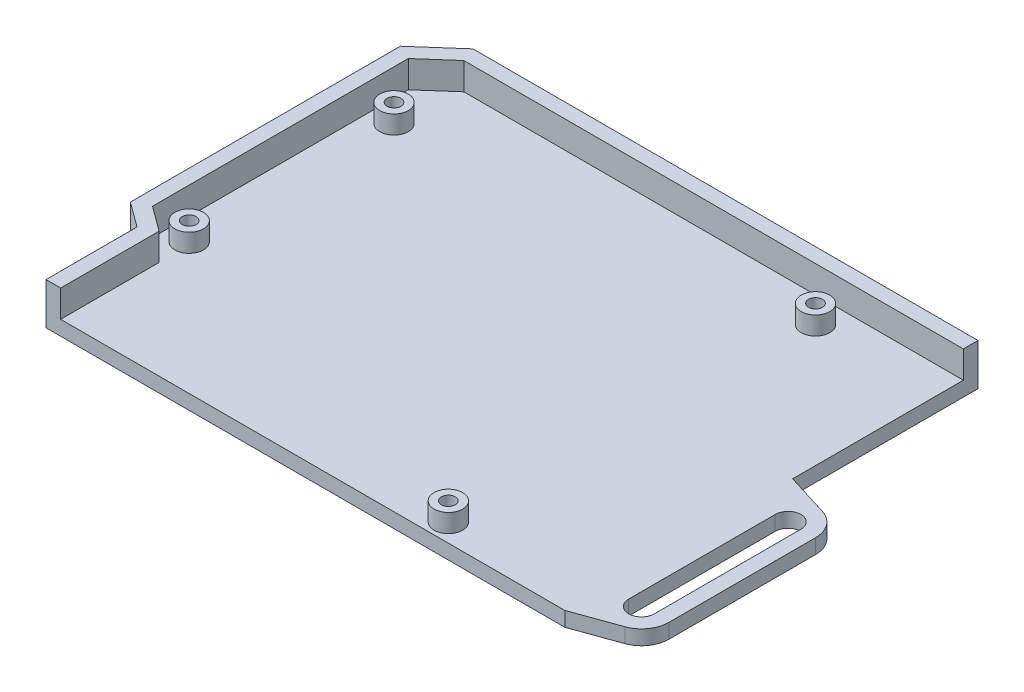
ISO-10303-21;
HEADER;
FILE_DESCRIPTION(('STEP AP214'),'2;1');
FILE_NAME('part.step','',(''),(''),'','','');
FILE_SCHEMA(('AUTOMOTIVE_DESIGN { 1 0 10303 214 1 1 1 1 }'));
ENDSEC;
DATA;
#1=APPLICATION_CONTEXT('core data for automotive mechanical design processes');
#2=APPLICATION_PROTOCOL_DEFINITION('international standard','automotive_design',2000,#1);
#3=PRODUCT_CONTEXT('',#1,'mechanical');
#4=PRODUCT('Part','Part','',(#3));
#5=PRODUCT_RELATED_PRODUCT_CATEGORY('part','',(#4));
#6=PRODUCT_DEFINITION_FORMATION('','',#4);
#7=PRODUCT_DEFINITION_CONTEXT('part definition',#1,'design');
#8=PRODUCT_DEFINITION('design','',#6,#7);
#9=PRODUCT_DEFINITION_SHAPE('','',#8);
#10=(LENGTH_UNIT() NAMED_UNIT(*) SI_UNIT(.MILLI.,.METRE.));
#11=(NAMED_UNIT(*) PLANE_ANGLE_UNIT() SI_UNIT($,.RADIAN.));
#12=(NAMED_UNIT(*) SI_UNIT($,.STERADIAN.) SOLID_ANGLE_UNIT());
#13=UNCERTAINTY_MEASURE_WITH_UNIT(LENGTH_MEASURE(1.E-05),#10,'distance_accuracy_value','');
#14=(GEOMETRIC_REPRESENTATION_CONTEXT(3) GLOBAL_UNCERTAINTY_ASSIGNED_CONTEXT((#13)) GLOBAL_UNIT_ASSIGNED_CONTEXT((#10,
#11,#12)) REPRESENTATION_CONTEXT('',''));
#15=CARTESIAN_POINT('',(0.,0.,0.));
#16=DIRECTION('',(0.,0.,1.));
#17=DIRECTION('',(1.,0.,0.));
#18=AXIS2_PLACEMENT_3D('',#15,#16,#17);
#19=CARTESIAN_POINT('',(73.8245355264989,2.,0.));
#20=DIRECTION('',(1.,0.,0.));
#21=DIRECTION('',(0.,0.,-1.));
#22=AXIS2_PLACEMENT_3D('',#19,#20,#21);
#23=PLANE('',#22);
#24=DIRECTION('',(0.,0.,1.));
#25=VECTOR('',#24,1.);
#26=CARTESIAN_POINT('',(73.8245355264989,0.,0.));
#27=LINE('',#26,#25);
#28=CARTESIAN_POINT('',(73.8245355264989,0.,-25.6999999999994));
#29=VERTEX_POINT('',#28);
#30=CARTESIAN_POINT('',(73.8245355264989,0.,-5.69999999999959));
#31=VERTEX_POINT('',#30);
#32=EDGE_CURVE('E485',#29,#31,#27,.T.);
#33=ORIENTED_EDGE('',*,*,#32,.F.);
#34=DIRECTION('',(0.,-1.,0.));
#35=VECTOR('',#34,1.);
#36=CARTESIAN_POINT('',(73.8245355264989,2.,-25.6999999999994));
#37=LINE('',#36,#35);
#38=CARTESIAN_POINT('',(73.8245355264989,2.,-25.6999999999994));
#39=VERTEX_POINT('',#38);
#40=EDGE_CURVE('E498',#39,#29,#37,.T.);
#41=ORIENTED_EDGE('',*,*,#40,.F.);
#42=DIRECTION('',(0.,0.,1.));
#43=VECTOR('',#42,1.);
#44=CARTESIAN_POINT('',(73.8245355264989,2.,0.));
#45=LINE('',#44,#43);
#46=CARTESIAN_POINT('',(73.8245355264989,2.,-5.69999999999959));
#47=VERTEX_POINT('',#46);
#48=EDGE_CURVE('E446',#39,#47,#45,.T.);
#49=ORIENTED_EDGE('',*,*,#48,.T.);
#50=DIRECTION('',(0.,-1.,0.));
#51=VECTOR('',#50,1.);
#52=CARTESIAN_POINT('',(73.8245355264989,2.,-5.69999999999959));
#53=LINE('',#52,#51);
#54=EDGE_CURVE('E500',#47,#31,#53,.T.);
#55=ORIENTED_EDGE('',*,*,#54,.T.);
#56=EDGE_LOOP('',(#33,#41,#49,#55));
#57=FACE_BOUND('',#56,.T.);
#58=ADVANCED_FACE('F197',(#57),#23,.T.);
#59=CARTESIAN_POINT('',(75.574535526499,2.,-25.6999999999992));
#60=DIRECTION('',(0.,-1.,0.));
#61=DIRECTION('',(0.,0.,-1.));
#62=AXIS2_PLACEMENT_3D('',#59,#60,#61);
#63=CYLINDRICAL_SURFACE('',#62,1.75000000000011);
#64=CARTESIAN_POINT('',(75.574535526499,0.,-25.6999999999992));
#65=DIRECTION('',(0.,1.,0.));
#66=DIRECTION('',(0.,0.,1.));
#67=AXIS2_PLACEMENT_3D('',#64,#65,#66);
#68=CIRCLE('',#67,1.75000000000011);
#69=CARTESIAN_POINT('',(77.3245355264991,0.,-25.6999999999994));
#70=VERTEX_POINT('',#69);
#71=EDGE_CURVE('E488',#70,#29,#68,.T.);
#72=ORIENTED_EDGE('',*,*,#71,.F.);
#73=DIRECTION('',(0.,-1.,0.));
#74=VECTOR('',#73,1.);
#75=CARTESIAN_POINT('',(77.3245355264991,2.,-25.6999999999994));
#76=LINE('',#75,#74);
#77=CARTESIAN_POINT('',(77.3245355264991,2.,-25.6999999999994));
#78=VERTEX_POINT('',#77);
#79=EDGE_CURVE('E495',#78,#70,#76,.T.);
#80=ORIENTED_EDGE('',*,*,#79,.F.);
#81=CARTESIAN_POINT('',(75.574535526499,2.,-25.6999999999992));
#82=DIRECTION('',(0.,1.,0.));
#83=DIRECTION('',(0.,0.,1.));
#84=AXIS2_PLACEMENT_3D('',#81,#82,#83);
#85=CIRCLE('',#84,1.75000000000011);
#86=EDGE_CURVE('E449',#78,#39,#85,.T.);
#87=ORIENTED_EDGE('',*,*,#86,.T.);
#88=ORIENTED_EDGE('',*,*,#40,.T.);
#89=EDGE_LOOP('',(#72,#80,#87,#88));
#90=FACE_BOUND('',#89,.T.);
#91=ADVANCED_FACE('F563',(#90),#63,.F.);
#92=CARTESIAN_POINT('',(77.3245355264991,2.,0.));
#93=DIRECTION('',(1.,0.,0.));
#94=DIRECTION('',(0.,0.,-1.));
#95=AXIS2_PLACEMENT_3D('',#92,#93,#94);
#96=PLANE('',#95);
#97=DIRECTION('',(0.,0.,1.));
#98=VECTOR('',#97,1.);
#99=CARTESIAN_POINT('',(77.3245355264991,0.,0.));
#100=LINE('',#99,#98);
#101=CARTESIAN_POINT('',(77.3245355264991,0.,-5.69999999999959));
#102=VERTEX_POINT('',#101);
#103=EDGE_CURVE('E429',#70,#102,#100,.T.);
#104=ORIENTED_EDGE('',*,*,#103,.T.);
#105=DIRECTION('',(0.,-1.,0.));
#106=VECTOR('',#105,1.);
#107=CARTESIAN_POINT('',(77.3245355264991,2.,-5.69999999999959));
#108=LINE('',#107,#106);
#109=CARTESIAN_POINT('',(77.3245355264991,2.,-5.69999999999959));
#110=VERTEX_POINT('',#109);
#111=EDGE_CURVE('E493',#110,#102,#108,.T.);
#112=ORIENTED_EDGE('',*,*,#111,.F.);
#113=DIRECTION('',(0.,0.,1.));
#114=VECTOR('',#113,1.);
#115=CARTESIAN_POINT('',(77.3245355264991,2.,0.));
#116=LINE('',#115,#114);
#117=EDGE_CURVE('E452',#78,#110,#116,.T.);
#118=ORIENTED_EDGE('',*,*,#117,.F.);
#119=ORIENTED_EDGE('',*,*,#79,.T.);
#120=EDGE_LOOP('',(#104,#112,#118,#119));
#121=FACE_BOUND('',#120,.T.);
#122=ADVANCED_FACE('F569',(#121),#96,.F.);
#123=CARTESIAN_POINT('',(75.574535526499,2.,-5.69999999999959));
#124=DIRECTION('',(0.,-1.,0.));
#125=DIRECTION('',(0.,0.,-1.));
#126=AXIS2_PLACEMENT_3D('',#123,#124,#125);
#127=CYLINDRICAL_SURFACE('',#126,1.75000000000011);
#128=CARTESIAN_POINT('',(75.574535526499,0.,-5.69999999999959));
#129=DIRECTION('',(0.,1.,0.));
#130=DIRECTION('',(0.,0.,1.));
#131=AXIS2_PLACEMENT_3D('',#128,#129,#130);
#132=CIRCLE('',#131,1.75000000000011);
#133=EDGE_CURVE('E482',#31,#102,#132,.T.);
#134=ORIENTED_EDGE('',*,*,#133,.F.);
#135=ORIENTED_EDGE('',*,*,#54,.F.);
#136=CARTESIAN_POINT('',(75.574535526499,2.,-5.69999999999959));
#137=DIRECTION('',(0.,1.,0.));
#138=DIRECTION('',(0.,0.,1.));
#139=AXIS2_PLACEMENT_3D('',#136,#137,#138);
#140=CIRCLE('',#139,1.75000000000011);
#141=EDGE_CURVE('E443',#47,#110,#140,.T.);
#142=ORIENTED_EDGE('',*,*,#141,.T.);
#143=ORIENTED_EDGE('',*,*,#111,.T.);
#144=EDGE_LOOP('',(#134,#135,#142,#143));
#145=FACE_BOUND('',#144,.T.);
#146=ADVANCED_FACE('F575',(#145),#127,.F.);
#147=CARTESIAN_POINT('',(75.574535526499,2.,-5.69999999999959));
#148=DIRECTION('',(0.,-1.,0.));
#149=DIRECTION('',(0.,0.,-1.));
#150=AXIS2_PLACEMENT_3D('',#147,#148,#149);
#151=CYLINDRICAL_SURFACE('',#150,3.75000000000011);
#152=CARTESIAN_POINT('',(75.574535526499,0.,-5.69999999999959));
#153=DIRECTION('',(0.,1.,0.));
#154=DIRECTION('',(0.,0.,1.));
#155=AXIS2_PLACEMENT_3D('',#152,#153,#154);
#156=CIRCLE('',#155,3.75000000000011);
#157=CARTESIAN_POINT('',(76.8422695780778,0.,-2.17078615347963));
#158=VERTEX_POINT('',#157);
#159=CARTESIAN_POINT('',(79.3245355264991,0.,-5.69999999999959));
#160=VERTEX_POINT('',#159);
#161=EDGE_CURVE('E457',#158,#160,#156,.T.);
#162=ORIENTED_EDGE('',*,*,#161,.T.);
#163=DIRECTION('',(0.,-1.,0.));
#164=VECTOR('',#163,1.);
#165=CARTESIAN_POINT('',(79.3245355264991,2.,-5.69999999999959));
#166=LINE('',#165,#164);
#167=CARTESIAN_POINT('',(79.3245355264991,2.,-5.69999999999959));
#168=VERTEX_POINT('',#167);
#169=EDGE_CURVE('E522',#168,#160,#166,.T.);
#170=ORIENTED_EDGE('',*,*,#169,.F.);
#171=CARTESIAN_POINT('',(75.574535526499,2.,-5.69999999999959));
#172=DIRECTION('',(0.,1.,0.));
#173=DIRECTION('',(0.,0.,1.));
#174=AXIS2_PLACEMENT_3D('',#171,#172,#173);
#175=CIRCLE('',#174,3.75000000000011);
#176=CARTESIAN_POINT('',(76.8422695780778,2.,-2.17078615347963));
#177=VERTEX_POINT('',#176);
#178=EDGE_CURVE('E428',#177,#168,#175,.T.);
#179=ORIENTED_EDGE('',*,*,#178,.F.);
#180=DIRECTION('',(0.,-1.,0.));
#181=VECTOR('',#180,1.);
#182=CARTESIAN_POINT('',(76.8422695780778,2.,-2.17078615347963));
#183=LINE('',#182,#181);
#184=EDGE_CURVE('E496',#177,#158,#183,.T.);
#185=ORIENTED_EDGE('',*,*,#184,.T.);
#186=EDGE_LOOP('',(#162,#170,#179,#185));
#187=FACE_BOUND('',#186,.T.);
#188=ADVANCED_FACE('F578',(#187),#151,.T.);
#189=CARTESIAN_POINT('',(79.3245355264991,2.,0.));
#190=DIRECTION('',(1.,0.,0.));
#191=DIRECTION('',(0.,0.,-1.));
#192=AXIS2_PLACEMENT_3D('',#189,#190,#191);
#193=PLANE('',#192);
#194=DIRECTION('',(0.,0.,1.));
#195=VECTOR('',#194,1.);
#196=CARTESIAN_POINT('',(79.3245355264991,0.,0.));
#197=LINE('',#196,#195);
#198=CARTESIAN_POINT('',(79.3245355264991,0.,-25.6999999999994));
#199=VERTEX_POINT('',#198);
#200=EDGE_CURVE('E460',#199,#160,#197,.T.);
#201=ORIENTED_EDGE('',*,*,#200,.F.);
#202=DIRECTION('',(0.,-1.,0.));
#203=VECTOR('',#202,1.);
#204=CARTESIAN_POINT('',(79.3245355264991,2.,-25.6999999999994));
#205=LINE('',#204,#203);
#206=CARTESIAN_POINT('',(79.3245355264991,2.,-25.6999999999994));
#207=VERTEX_POINT('',#206);
#208=EDGE_CURVE('E520',#207,#199,#205,.T.);
#209=ORIENTED_EDGE('',*,*,#208,.F.);
#210=DIRECTION('',(0.,0.,1.));
#211=VECTOR('',#210,1.);
#212=CARTESIAN_POINT('',(79.3245355264991,2.,0.));
#213=LINE('',#212,#211);
#214=EDGE_CURVE('E431',#207,#168,#213,.T.);
#215=ORIENTED_EDGE('',*,*,#214,.T.);
#216=ORIENTED_EDGE('',*,*,#169,.T.);
#217=EDGE_LOOP('',(#201,#209,#215,#216));
#218=FACE_BOUND('',#217,.T.);
#219=ADVANCED_FACE('F611',(#218),#193,.T.);
#220=CARTESIAN_POINT('',(75.574535526499,2.,-25.6999999999992));
#221=DIRECTION('',(0.,-1.,0.));
#222=DIRECTION('',(0.,0.,-1.));
#223=AXIS2_PLACEMENT_3D('',#220,#221,#222);
#224=CYLINDRICAL_SURFACE('',#223,3.75000000000011);
#225=CARTESIAN_POINT('',(75.574535526499,0.,-25.6999999999992));
#226=DIRECTION('',(0.,1.,0.));
#227=DIRECTION('',(0.,0.,1.));
#228=AXIS2_PLACEMENT_3D('',#225,#226,#227);
#229=CIRCLE('',#228,3.75000000000011);
#230=CARTESIAN_POINT('',(76.6771867461201,0.,-29.2842238054931));
#231=VERTEX_POINT('',#230);
#232=EDGE_CURVE('E463',#199,#231,#229,.T.);
#233=ORIENTED_EDGE('',*,*,#232,.T.);
#234=DIRECTION('',(0.,-1.,0.));
#235=VECTOR('',#234,1.);
#236=CARTESIAN_POINT('',(76.6771867461201,2.,-29.2842238054931));
#237=LINE('',#236,#235);
#238=CARTESIAN_POINT('',(76.6771867461201,2.,-29.2842238054931));
#239=VERTEX_POINT('',#238);
#240=EDGE_CURVE('E518',#239,#231,#237,.T.);
#241=ORIENTED_EDGE('',*,*,#240,.F.);
#242=CARTESIAN_POINT('',(75.574535526499,2.,-25.6999999999992));
#243=DIRECTION('',(0.,1.,0.));
#244=DIRECTION('',(0.,0.,1.));
#245=AXIS2_PLACEMENT_3D('',#242,#243,#244);
#246=CIRCLE('',#245,3.75000000000011);
#247=EDGE_CURVE('E434',#207,#239,#246,.T.);
#248=ORIENTED_EDGE('',*,*,#247,.F.);
#249=ORIENTED_EDGE('',*,*,#208,.T.);
#250=EDGE_LOOP('',(#233,#241,#248,#249));
#251=FACE_BOUND('',#250,.T.);
#252=ADVANCED_FACE('F607',(#251),#224,.T.);
#253=CARTESIAN_POINT('',(14.8595752663752,2.,-48.3018042890914));
#254=DIRECTION('',(0.294040325232303,0.,-0.955793014798331));
#255=DIRECTION('',(-0.955793014798331,0.,-0.294040325232303));
#256=AXIS2_PLACEMENT_3D('',#253,#254,#255);
#257=PLANE('',#256);
#258=DIRECTION('',(0.955793014798331,0.,0.294040325232303));
#259=VECTOR('',#258,1.);
#260=CARTESIAN_POINT('',(14.8595752663752,0.,-48.3018042890914));
#261=LINE('',#260,#259);
#262=CARTESIAN_POINT('',(70.799071052998,0.,-31.0925683146057));
#263=VERTEX_POINT('',#262);
#264=EDGE_CURVE('E466',#263,#231,#261,.T.);
#265=ORIENTED_EDGE('',*,*,#264,.F.);
#266=DIRECTION('',(0.,-1.,0.));
#267=VECTOR('',#266,1.);
#268=CARTESIAN_POINT('',(70.799071052998,2.,-31.0925683146057));
#269=LINE('',#268,#267);
#270=CARTESIAN_POINT('',(70.799071052998,2.,-31.0925683146057));
#271=VERTEX_POINT('',#270);
#272=EDGE_CURVE('E516',#271,#263,#269,.T.);
#273=ORIENTED_EDGE('',*,*,#272,.F.);
#274=DIRECTION('',(0.955793014798331,0.,0.294040325232303));
#275=VECTOR('',#274,1.);
#276=CARTESIAN_POINT('',(14.8595752663752,2.,-48.3018042890914));
#277=LINE('',#276,#275);
#278=EDGE_CURVE('E436',#271,#239,#277,.T.);
#279=ORIENTED_EDGE('',*,*,#278,.T.);
#280=ORIENTED_EDGE('',*,*,#240,.T.);
#281=EDGE_LOOP('',(#265,#273,#279,#280));
#282=FACE_BOUND('',#281,.T.);
#283=ADVANCED_FACE('F603',(#282),#257,.T.);
#284=CARTESIAN_POINT('',(70.799071052998,2.,0.));
#285=DIRECTION('',(-1.,0.,0.));
#286=DIRECTION('',(0.,0.,1.));
#287=AXIS2_PLACEMENT_3D('',#284,#285,#286);
#288=PLANE('',#287);
#289=DIRECTION('',(0.,0.,-1.));
#290=VECTOR('',#289,1.);
#291=CARTESIAN_POINT('',(70.799071052998,0.,0.));
#292=LINE('',#291,#290);
#293=CARTESIAN_POINT('',(70.799071052998,0.,-56.3999999999999));
#294=VERTEX_POINT('',#293);
#295=EDGE_CURVE('E469',#263,#294,#292,.T.);
#296=ORIENTED_EDGE('',*,*,#295,.T.);
#297=DIRECTION('',(0.,-1.,0.));
#298=VECTOR('',#297,1.);
#299=CARTESIAN_POINT('',(70.799071052998,2.,-56.3999999999999));
#300=LINE('',#299,#298);
#301=CARTESIAN_POINT('',(70.799071052998,5.7,-56.3999999999999));
#302=VERTEX_POINT('',#301);
#303=EDGE_CURVE('E354',#302,#294,#300,.T.);
#304=ORIENTED_EDGE('',*,*,#303,.F.);
#305=DIRECTION('',(0.,0.,-1.));
#306=VECTOR('',#305,1.);
#307=CARTESIAN_POINT('',(70.799071052998,5.7,-54.3999999999999));
#308=LINE('',#307,#306);
#309=CARTESIAN_POINT('',(70.799071052998,5.7,-54.3999999999999));
#310=VERTEX_POINT('',#309);
#311=EDGE_CURVE('E369',#310,#302,#308,.T.);
#312=ORIENTED_EDGE('',*,*,#311,.F.);
#313=DIRECTION('',(0.,-1.,0.));
#314=VECTOR('',#313,1.);
#315=CARTESIAN_POINT('',(70.799071052998,5.7,-54.3999999999999));
#316=LINE('',#315,#314);
#317=CARTESIAN_POINT('',(70.799071052998,2.,-54.3999999999999));
#318=VERTEX_POINT('',#317);
#319=EDGE_CURVE('E396',#310,#318,#316,.T.);
#320=ORIENTED_EDGE('',*,*,#319,.T.);
#321=DIRECTION('',(0.,0.,-1.));
#322=VECTOR('',#321,1.);
#323=CARTESIAN_POINT('',(70.799071052998,2.,0.));
#324=LINE('',#323,#322);
#325=EDGE_CURVE('E439',#271,#318,#324,.T.);
#326=ORIENTED_EDGE('',*,*,#325,.F.);
#327=ORIENTED_EDGE('',*,*,#272,.T.);
#328=EDGE_LOOP('',(#296,#304,#312,#320,#326,#327));
#329=FACE_BOUND('',#328,.T.);
#330=ADVANCED_FACE('F600',(#329),#288,.F.);
#331=CARTESIAN_POINT('',(0.,2.,-56.3999999999999));
#332=DIRECTION('',(0.,0.,1.));
#333=DIRECTION('',(1.,0.,0.));
#334=AXIS2_PLACEMENT_3D('',#331,#332,#333);
#335=PLANE('',#334);
#336=DIRECTION('',(-1.,0.,0.));
#337=VECTOR('',#336,1.);
#338=CARTESIAN_POINT('',(0.,0.,-56.3999999999999));
#339=LINE('',#338,#337);
#340=CARTESIAN_POINT('',(1.86591872622439,0.,-56.3999999999999));
#341=VERTEX_POINT('',#340);
#342=EDGE_CURVE('E351',#294,#341,#339,.T.);
#343=ORIENTED_EDGE('',*,*,#342,.T.);
#344=DIRECTION('',(0.,-1.,0.));
#345=VECTOR('',#344,1.);
#346=CARTESIAN_POINT('',(1.86591872622439,2.,-56.3999999999999));
#347=LINE('',#346,#345);
#348=CARTESIAN_POINT('',(1.86591872622439,5.7,-56.3999999999999));
#349=VERTEX_POINT('',#348);
#350=EDGE_CURVE('E344',#349,#341,#347,.T.);
#351=ORIENTED_EDGE('',*,*,#350,.F.);
#352=DIRECTION('',(-1.,0.,0.));
#353=VECTOR('',#352,1.);
#354=CARTESIAN_POINT('',(70.799071052998,5.7,-56.3999999999999));
#355=LINE('',#354,#353);
#356=EDGE_CURVE('E349',#302,#349,#355,.T.);
#357=ORIENTED_EDGE('',*,*,#356,.F.);
#358=ORIENTED_EDGE('',*,*,#303,.T.);
#359=EDGE_LOOP('',(#343,#351,#357,#358));
#360=FACE_BOUND('',#359,.T.);
#361=ADVANCED_FACE('F346',(#360),#335,.F.);
#362=CARTESIAN_POINT('',(-27.1630496706412,2.,-30.7932006379113));
#363=DIRECTION('',(0.66152000854493,0.,0.749927515360462));
#364=DIRECTION('',(0.749927515360462,0.,-0.66152000854493));
#365=AXIS2_PLACEMENT_3D('',#362,#363,#364);
#366=PLANE('',#365);
#367=DIRECTION('',(-0.749927515360462,0.,0.661520008544929));
#368=VECTOR('',#367,1.);
#369=CARTESIAN_POINT('',(-27.1630496706412,0.,-30.7932006379113));
#370=LINE('',#369,#368);
#371=CARTESIAN_POINT('',(-3.40092894700203,0.,-51.7540508296686));
#372=VERTEX_POINT('',#371);
#373=EDGE_CURVE('E472',#341,#372,#370,.T.);
#374=ORIENTED_EDGE('',*,*,#373,.T.);
#375=DIRECTION('',(0.,-1.,0.));
#376=VECTOR('',#375,1.);
#377=CARTESIAN_POINT('',(-3.40092894700203,2.,-51.7540508296686));
#378=LINE('',#377,#376);
#379=CARTESIAN_POINT('',(-3.40092894700203,5.7,-51.7540508296686));
#380=VERTEX_POINT('',#379);
#381=EDGE_CURVE('E355',#380,#372,#378,.T.);
#382=ORIENTED_EDGE('',*,*,#381,.F.);
#383=DIRECTION('',(-0.749927515360462,0.,0.661520008544929));
#384=VECTOR('',#383,1.);
#385=CARTESIAN_POINT('',(1.86591872622439,5.7,-56.3999999999999));
#386=LINE('',#385,#384);
#387=EDGE_CURVE('E358',#349,#380,#386,.T.);
#388=ORIENTED_EDGE('',*,*,#387,.F.);
#389=ORIENTED_EDGE('',*,*,#350,.T.);
#390=EDGE_LOOP('',(#374,#382,#388,#389));
#391=FACE_BOUND('',#390,.T.);
#392=ADVANCED_FACE('F359',(#391),#366,.F.);
#393=CARTESIAN_POINT('',(-3.40092894700199,2.,0.));
#394=DIRECTION('',(1.,0.,0.));
#395=DIRECTION('',(0.,0.,-1.));
#396=AXIS2_PLACEMENT_3D('',#393,#394,#395);
#397=PLANE('',#396);
#398=DIRECTION('',(0.,0.,1.));
#399=VECTOR('',#398,1.);
#400=CARTESIAN_POINT('',(-3.40092894700199,0.,0.));
#401=LINE('',#400,#399);
#402=CARTESIAN_POINT('',(-3.400928947002,0.,-14.9219400472764));
#403=VERTEX_POINT('',#402);
#404=EDGE_CURVE('E474',#372,#403,#401,.T.);
#405=ORIENTED_EDGE('',*,*,#404,.T.);
#406=DIRECTION('',(0.,-1.,0.));
#407=VECTOR('',#406,1.);
#408=CARTESIAN_POINT('',(-3.400928947002,2.,-14.9219400472764));
#409=LINE('',#408,#407);
#410=CARTESIAN_POINT('',(-3.400928947002,5.7,-14.9219400472764));
#411=VERTEX_POINT('',#410);
#412=EDGE_CURVE('E511',#411,#403,#409,.T.);
#413=ORIENTED_EDGE('',*,*,#412,.F.);
#414=DIRECTION('',(0.,0.,1.));
#415=VECTOR('',#414,1.);
#416=CARTESIAN_POINT('',(-3.40092894700203,5.7,-51.7540508296686));
#417=LINE('',#416,#415);
#418=EDGE_CURVE('E364',#380,#411,#417,.T.);
#419=ORIENTED_EDGE('',*,*,#418,.F.);
#420=ORIENTED_EDGE('',*,*,#381,.T.);
#421=EDGE_LOOP('',(#405,#413,#419,#420));
#422=FACE_BOUND('',#421,.T.);
#423=ADVANCED_FACE('F591',(#422),#397,.F.);
#424=CARTESIAN_POINT('',(5.92801163938671,2.,-8.06429855302219));
#425=DIRECTION('',(0.592285409734433,0.,-0.805728237941128));
#426=DIRECTION('',(-0.805728237941128,0.,-0.592285409734433));
#427=AXIS2_PLACEMENT_3D('',#424,#425,#426);
#428=PLANE('',#427);
#429=DIRECTION('',(0.805728237941128,0.,0.592285409734433));
#430=VECTOR('',#429,1.);
#431=CARTESIAN_POINT('',(5.92801163938671,0.,-8.06429855302219));
#432=LINE('',#431,#430);
#433=CARTESIAN_POINT('',(0.,0.,-12.4219400472765));
#434=VERTEX_POINT('',#433);
#435=EDGE_CURVE('E476',#403,#434,#432,.T.);
#436=ORIENTED_EDGE('',*,*,#435,.T.);
#437=DIRECTION('',(0.,-1.,0.));
#438=VECTOR('',#437,1.);
#439=CARTESIAN_POINT('',(0.,2.,-12.4219400472765));
#440=LINE('',#439,#438);
#441=CARTESIAN_POINT('',(0.,5.7,-12.4219400472765));
#442=VERTEX_POINT('',#441);
#443=EDGE_CURVE('E508',#442,#434,#440,.T.);
#444=ORIENTED_EDGE('',*,*,#443,.F.);
#445=DIRECTION('',(0.805728237941128,0.,0.592285409734434));
#446=VECTOR('',#445,1.);
#447=CARTESIAN_POINT('',(-3.400928947002,5.7,-14.9219400472764));
#448=LINE('',#447,#446);
#449=EDGE_CURVE('E377',#411,#442,#448,.T.);
#450=ORIENTED_EDGE('',*,*,#449,.F.);
#451=ORIENTED_EDGE('',*,*,#412,.T.);
#452=EDGE_LOOP('',(#436,#444,#450,#451));
#453=FACE_BOUND('',#452,.T.);
#454=ADVANCED_FACE('F587',(#453),#428,.F.);
#455=CARTESIAN_POINT('',(0.,2.,0.));
#456=DIRECTION('',(1.,0.,0.));
#457=DIRECTION('',(0.,0.,-1.));
#458=AXIS2_PLACEMENT_3D('',#455,#456,#457);
#459=PLANE('',#458);
#460=DIRECTION('',(0.,0.,1.));
#461=VECTOR('',#460,1.);
#462=CARTESIAN_POINT('',(0.,0.,0.));
#463=LINE('',#462,#461);
#464=CARTESIAN_POINT('',(0.,0.,0.));
#465=VERTEX_POINT('',#464);
#466=EDGE_CURVE('E478',#434,#465,#463,.T.);
#467=ORIENTED_EDGE('',*,*,#466,.T.);
#468=DIRECTION('',(0.,-1.,0.));
#469=VECTOR('',#468,1.);
#470=CARTESIAN_POINT('',(0.,2.,0.));
#471=LINE('',#470,#469);
#472=CARTESIAN_POINT('',(0.,5.7,0.));
#473=VERTEX_POINT('',#472);
#474=EDGE_CURVE('E505',#473,#465,#471,.T.);
#475=ORIENTED_EDGE('',*,*,#474,.F.);
#476=DIRECTION('',(0.,0.,1.));
#477=VECTOR('',#476,1.);
#478=CARTESIAN_POINT('',(0.,5.7,-12.4219400472765));
#479=LINE('',#478,#477);
#480=EDGE_CURVE('E380',#442,#473,#479,.T.);
#481=ORIENTED_EDGE('',*,*,#480,.F.);
#482=ORIENTED_EDGE('',*,*,#443,.T.);
#483=EDGE_LOOP('',(#467,#475,#481,#482));
#484=FACE_BOUND('',#483,.T.);
#485=ADVANCED_FACE('F583',(#484),#459,.F.);
#486=CARTESIAN_POINT('',(0.,2.,0.));
#487=DIRECTION('',(0.,0.,-1.));
#488=DIRECTION('',(-1.,0.,0.));
#489=AXIS2_PLACEMENT_3D('',#486,#487,#488);
#490=PLANE('',#489);
#491=DIRECTION('',(1.,0.,0.));
#492=VECTOR('',#491,1.);
#493=CARTESIAN_POINT('',(0.,0.,0.));
#494=LINE('',#493,#492);
#495=CARTESIAN_POINT('',(70.799071052998,0.,0.));
#496=VERTEX_POINT('',#495);
#497=EDGE_CURVE('E480',#465,#496,#494,.T.);
#498=ORIENTED_EDGE('',*,*,#497,.T.);
#499=DIRECTION('',(0.,-1.,0.));
#500=VECTOR('',#499,1.);
#501=CARTESIAN_POINT('',(70.799071052998,2.,0.));
#502=LINE('',#501,#500);
#503=CARTESIAN_POINT('',(70.799071052998,2.,0.));
#504=VERTEX_POINT('',#503);
#505=EDGE_CURVE('E454',#504,#496,#502,.T.);
#506=ORIENTED_EDGE('',*,*,#505,.F.);
#507=DIRECTION('',(1.,0.,0.));
#508=VECTOR('',#507,1.);
#509=CARTESIAN_POINT('',(0.,2.,0.));
#510=LINE('',#509,#508);
#511=CARTESIAN_POINT('',(2.,2.,0.));
#512=VERTEX_POINT('',#511);
#513=EDGE_CURVE('E441',#512,#504,#510,.T.);
#514=ORIENTED_EDGE('',*,*,#513,.F.);
#515=DIRECTION('',(0.,-1.,0.));
#516=VECTOR('',#515,1.);
#517=CARTESIAN_POINT('',(2.,5.7,0.));
#518=LINE('',#517,#516);
#519=CARTESIAN_POINT('',(2.,5.7,0.));
#520=VERTEX_POINT('',#519);
#521=EDGE_CURVE('E421',#520,#512,#518,.T.);
#522=ORIENTED_EDGE('',*,*,#521,.F.);
#523=DIRECTION('',(1.,0.,0.));
#524=VECTOR('',#523,1.);
#525=CARTESIAN_POINT('',(0.,5.7,0.));
#526=LINE('',#525,#524);
#527=EDGE_CURVE('E383',#473,#520,#526,.T.);
#528=ORIENTED_EDGE('',*,*,#527,.F.);
#529=ORIENTED_EDGE('',*,*,#474,.T.);
#530=EDGE_LOOP('',(#498,#506,#514,#522,#528,#529));
#531=FACE_BOUND('',#530,.T.);
#532=ADVANCED_FACE('F580',(#531),#490,.F.);
#533=CARTESIAN_POINT('',(8.09135648219427,2.,22.5253295819631));
#534=DIRECTION('',(-0.338062413754331,0.,-0.941123692405305));
#535=DIRECTION('',(-0.941123692405305,0.,0.338062413754331));
#536=AXIS2_PLACEMENT_3D('',#533,#534,#535);
#537=PLANE('',#536);
#538=DIRECTION('',(0.941123692405305,0.,-0.338062413754331));
#539=VECTOR('',#538,1.);
#540=CARTESIAN_POINT('',(8.09135648219427,0.,22.5253295819631));
#541=LINE('',#540,#539);
#542=EDGE_CURVE('E424',#496,#158,#541,.T.);
#543=ORIENTED_EDGE('',*,*,#542,.T.);
#544=ORIENTED_EDGE('',*,*,#184,.F.);
#545=DIRECTION('',(0.941123692405305,0.,-0.338062413754331));
#546=VECTOR('',#545,1.);
#547=CARTESIAN_POINT('',(8.09135648219427,2.,22.5253295819631));
#548=LINE('',#547,#546);
#549=EDGE_CURVE('E425',#504,#177,#548,.T.);
#550=ORIENTED_EDGE('',*,*,#549,.F.);
#551=ORIENTED_EDGE('',*,*,#505,.T.);
#552=EDGE_LOOP('',(#543,#544,#550,#551));
#553=FACE_BOUND('',#552,.T.);
#554=ADVANCED_FACE('F199',(#553),#537,.F.);
#555=CARTESIAN_POINT('',(0.,0.,0.));
#556=DIRECTION('',(0.,1.,0.));
#557=DIRECTION('',(0.,0.,1.));
#558=AXIS2_PLACEMENT_3D('',#555,#556,#557);
#559=PLANE('',#558);
#560=ORIENTED_EDGE('',*,*,#542,.F.);
#561=ORIENTED_EDGE('',*,*,#497,.F.);
#562=ORIENTED_EDGE('',*,*,#466,.F.);
#563=ORIENTED_EDGE('',*,*,#435,.F.);
#564=ORIENTED_EDGE('',*,*,#404,.F.);
#565=ORIENTED_EDGE('',*,*,#373,.F.);
#566=ORIENTED_EDGE('',*,*,#342,.F.);
#567=ORIENTED_EDGE('',*,*,#295,.F.);
#568=ORIENTED_EDGE('',*,*,#264,.T.);
#569=ORIENTED_EDGE('',*,*,#232,.F.);
#570=ORIENTED_EDGE('',*,*,#200,.T.);
#571=ORIENTED_EDGE('',*,*,#161,.F.);
#572=EDGE_LOOP('',(#560,#561,#562,#563,#564,#565,#566,#567,#568,#569,#570,#571));
#573=FACE_BOUND('',#572,.T.);
#574=ORIENTED_EDGE('',*,*,#133,.T.);
#575=ORIENTED_EDGE('',*,*,#103,.F.);
#576=ORIENTED_EDGE('',*,*,#71,.T.);
#577=ORIENTED_EDGE('',*,*,#32,.T.);
#578=EDGE_LOOP('',(#574,#575,#576,#577));
#579=FACE_BOUND('',#578,.T.);
#580=ADVANCED_FACE('F625',(#573,#579),#559,.F.);
#581=CARTESIAN_POINT('',(0.,2.,0.));
#582=DIRECTION('',(0.,1.,0.));
#583=DIRECTION('',(0.,0.,1.));
#584=AXIS2_PLACEMENT_3D('',#581,#582,#583);
#585=PLANE('',#584);
#586=CARTESIAN_POINT('',(54.119071052998,2.,-50.8999999999999));
#587=DIRECTION('',(0.,1.,0.));
#588=DIRECTION('',(0.,0.,1.));
#589=AXIS2_PLACEMENT_3D('',#586,#587,#588);
#590=CIRCLE('',#589,1.95000000000002);
#591=CARTESIAN_POINT('',(54.119071052998,2.,-48.9499999999999));
#592=VERTEX_POINT('',#591);
#593=EDGE_CURVE('E744',#592,#592,#590,.T.);
#594=ORIENTED_EDGE('',*,*,#593,.F.);
#595=EDGE_LOOP('',(#594));
#596=FACE_BOUND('',#595,.T.);
#597=CARTESIAN_POINT('',(52.409071052998,2.,-2.50499999999998));
#598=DIRECTION('',(0.,1.,0.));
#599=DIRECTION('',(0.,0.,1.));
#600=AXIS2_PLACEMENT_3D('',#597,#598,#599);
#601=CIRCLE('',#600,1.95000000000001);
#602=CARTESIAN_POINT('',(52.409071052998,2.,-0.554999999999965));
#603=VERTEX_POINT('',#602);
#604=EDGE_CURVE('E735',#603,#603,#601,.T.);
#605=ORIENTED_EDGE('',*,*,#604,.F.);
#606=EDGE_LOOP('',(#605));
#607=FACE_BOUND('',#606,.T.);
#608=CARTESIAN_POINT('',(1.59907105299799,2.,-17.9399999999998));
#609=DIRECTION('',(0.,1.,0.));
#610=DIRECTION('',(0.,0.,1.));
#611=AXIS2_PLACEMENT_3D('',#608,#609,#610);
#612=CIRCLE('',#611,1.95000000000001);
#613=CARTESIAN_POINT('',(1.59907105299799,2.,-15.9899999999998));
#614=VERTEX_POINT('',#613);
#615=EDGE_CURVE('E725',#614,#614,#612,.T.);
#616=ORIENTED_EDGE('',*,*,#615,.F.);
#617=EDGE_LOOP('',(#616));
#618=FACE_BOUND('',#617,.T.);
#619=CARTESIAN_POINT('',(1.59907105299797,2.,-45.8999999999998));
#620=DIRECTION('',(0.,1.,0.));
#621=DIRECTION('',(0.,0.,1.));
#622=AXIS2_PLACEMENT_3D('',#619,#620,#621);
#623=CIRCLE('',#622,1.95000000000001);
#624=CARTESIAN_POINT('',(1.59907105299797,2.,-43.9499999999998));
#625=VERTEX_POINT('',#624);
#626=EDGE_CURVE('E373',#625,#625,#623,.T.);
#627=ORIENTED_EDGE('',*,*,#626,.F.);
#628=EDGE_LOOP('',(#627));
#629=FACE_BOUND('',#628,.T.);
#630=DIRECTION('',(1.,0.,0.));
#631=VECTOR('',#630,1.);
#632=CARTESIAN_POINT('',(70.799071052998,2.,-54.3999999999999));
#633=LINE('',#632,#631);
#634=CARTESIAN_POINT('',(2.6219729087414,2.,-54.3999999999999));
#635=VERTEX_POINT('',#634);
#636=EDGE_CURVE('E212',#635,#318,#633,.T.);
#637=ORIENTED_EDGE('',*,*,#636,.F.);
#638=DIRECTION('',(0.749927515360462,0.,-0.66152000854493));
#639=VECTOR('',#638,1.);
#640=CARTESIAN_POINT('',(2.6219729087414,2.,-54.3999999999999));
#641=LINE('',#640,#639);
#642=CARTESIAN_POINT('',(-1.40092894700203,2.,-50.8513502765561));
#643=VERTEX_POINT('',#642);
#644=EDGE_CURVE('E216',#643,#635,#641,.T.);
#645=ORIENTED_EDGE('',*,*,#644,.F.);
#646=DIRECTION('',(0.,0.,-1.));
#647=VECTOR('',#646,1.);
#648=CARTESIAN_POINT('',(-1.40092894700203,2.,-50.8513502765561));
#649=LINE('',#648,#647);
#650=CARTESIAN_POINT('',(-1.400928947002,2.,-15.9339800157586));
#651=VERTEX_POINT('',#650);
#652=EDGE_CURVE('E404',#651,#643,#649,.T.);
#653=ORIENTED_EDGE('',*,*,#652,.F.);
#654=DIRECTION('',(-0.805728237941128,0.,-0.592285409734433));
#655=VECTOR('',#654,1.);
#656=CARTESIAN_POINT('',(-1.400928947002,2.,-15.9339800157586));
#657=LINE('',#656,#655);
#658=CARTESIAN_POINT('',(2.,2.,-13.4339800157587));
#659=VERTEX_POINT('',#658);
#660=EDGE_CURVE('E400',#659,#651,#657,.T.);
#661=ORIENTED_EDGE('',*,*,#660,.F.);
#662=DIRECTION('',(0.,0.,-1.));
#663=VECTOR('',#662,1.);
#664=CARTESIAN_POINT('',(2.,2.,-13.4339800157587));
#665=LINE('',#664,#663);
#666=EDGE_CURVE('E397',#512,#659,#665,.T.);
#667=ORIENTED_EDGE('',*,*,#666,.F.);
#668=ORIENTED_EDGE('',*,*,#513,.T.);
#669=ORIENTED_EDGE('',*,*,#549,.T.);
#670=ORIENTED_EDGE('',*,*,#178,.T.);
#671=ORIENTED_EDGE('',*,*,#214,.F.);
#672=ORIENTED_EDGE('',*,*,#247,.T.);
#673=ORIENTED_EDGE('',*,*,#278,.F.);
#674=ORIENTED_EDGE('',*,*,#325,.T.);
#675=EDGE_LOOP('',(#637,#645,#653,#661,#667,#668,#669,#670,#671,#672,#673,#674));
#676=FACE_BOUND('',#675,.T.);
#677=ORIENTED_EDGE('',*,*,#141,.F.);
#678=ORIENTED_EDGE('',*,*,#48,.F.);
#679=ORIENTED_EDGE('',*,*,#86,.F.);
#680=ORIENTED_EDGE('',*,*,#117,.T.);
#681=EDGE_LOOP('',(#677,#678,#679,#680));
#682=FACE_BOUND('',#681,.T.);
#683=ADVANCED_FACE('F551',(#596,#607,#618,#629,#676,#682),#585,.T.);
#684=CARTESIAN_POINT('',(2.,5.7,-13.4339800157587));
#685=DIRECTION('',(-1.,0.,0.));
#686=DIRECTION('',(0.,0.,1.));
#687=AXIS2_PLACEMENT_3D('',#684,#685,#686);
#688=PLANE('',#687);
#689=ORIENTED_EDGE('',*,*,#666,.T.);
#690=DIRECTION('',(0.,-1.,0.));
#691=VECTOR('',#690,1.);
#692=CARTESIAN_POINT('',(2.,5.7,-13.4339800157587));
#693=LINE('',#692,#691);
#694=CARTESIAN_POINT('',(2.,5.7,-13.4339800157587));
#695=VERTEX_POINT('',#694);
#696=EDGE_CURVE('E418',#695,#659,#693,.T.);
#697=ORIENTED_EDGE('',*,*,#696,.F.);
#698=DIRECTION('',(0.,0.,-1.));
#699=VECTOR('',#698,1.);
#700=CARTESIAN_POINT('',(2.,5.7,-13.4339800157587));
#701=LINE('',#700,#699);
#702=EDGE_CURVE('E385',#520,#695,#701,.T.);
#703=ORIENTED_EDGE('',*,*,#702,.F.);
#704=ORIENTED_EDGE('',*,*,#521,.T.);
#705=EDGE_LOOP('',(#689,#697,#703,#704));
#706=FACE_BOUND('',#705,.T.);
#707=ADVANCED_FACE('F666',(#706),#688,.F.);
#708=CARTESIAN_POINT('',(-1.400928947002,5.7,-15.9339800157586));
#709=DIRECTION('',(-0.592285409734433,0.,0.805728237941128));
#710=DIRECTION('',(0.805728237941128,0.,0.592285409734433));
#711=AXIS2_PLACEMENT_3D('',#708,#709,#710);
#712=PLANE('',#711);
#713=ORIENTED_EDGE('',*,*,#660,.T.);
#714=DIRECTION('',(0.,-1.,0.));
#715=VECTOR('',#714,1.);
#716=CARTESIAN_POINT('',(-1.400928947002,5.7,-15.9339800157586));
#717=LINE('',#716,#715);
#718=CARTESIAN_POINT('',(-1.400928947002,5.7,-15.9339800157586));
#719=VERTEX_POINT('',#718);
#720=EDGE_CURVE('E415',#719,#651,#717,.T.);
#721=ORIENTED_EDGE('',*,*,#720,.F.);
#722=DIRECTION('',(-0.805728237941128,0.,-0.592285409734433));
#723=VECTOR('',#722,1.);
#724=CARTESIAN_POINT('',(-1.400928947002,5.7,-15.9339800157586));
#725=LINE('',#724,#723);
#726=EDGE_CURVE('E387',#695,#719,#725,.T.);
#727=ORIENTED_EDGE('',*,*,#726,.F.);
#728=ORIENTED_EDGE('',*,*,#696,.T.);
#729=EDGE_LOOP('',(#713,#721,#727,#728));
#730=FACE_BOUND('',#729,.T.);
#731=ADVANCED_FACE('F661',(#730),#712,.F.);
#732=CARTESIAN_POINT('',(-1.40092894700203,5.7,-50.8513502765561));
#733=DIRECTION('',(-1.,0.,0.));
#734=DIRECTION('',(0.,0.,1.));
#735=AXIS2_PLACEMENT_3D('',#732,#733,#734);
#736=PLANE('',#735);
#737=ORIENTED_EDGE('',*,*,#652,.T.);
#738=DIRECTION('',(0.,-1.,0.));
#739=VECTOR('',#738,1.);
#740=CARTESIAN_POINT('',(-1.40092894700203,5.7,-50.8513502765561));
#741=LINE('',#740,#739);
#742=CARTESIAN_POINT('',(-1.40092894700203,5.7,-50.8513502765561));
#743=VERTEX_POINT('',#742);
#744=EDGE_CURVE('E412',#743,#643,#741,.T.);
#745=ORIENTED_EDGE('',*,*,#744,.F.);
#746=DIRECTION('',(0.,0.,-1.));
#747=VECTOR('',#746,1.);
#748=CARTESIAN_POINT('',(-1.40092894700203,5.7,-50.8513502765561));
#749=LINE('',#748,#747);
#750=EDGE_CURVE('E389',#719,#743,#749,.T.);
#751=ORIENTED_EDGE('',*,*,#750,.F.);
#752=ORIENTED_EDGE('',*,*,#720,.T.);
#753=EDGE_LOOP('',(#737,#745,#751,#752));
#754=FACE_BOUND('',#753,.T.);
#755=ADVANCED_FACE('F658',(#754),#736,.F.);
#756=CARTESIAN_POINT('',(2.6219729087414,5.7,-54.3999999999999));
#757=DIRECTION('',(-0.66152000854493,0.,-0.749927515360462));
#758=DIRECTION('',(-0.749927515360462,0.,0.66152000854493));
#759=AXIS2_PLACEMENT_3D('',#756,#757,#758);
#760=PLANE('',#759);
#761=ORIENTED_EDGE('',*,*,#644,.T.);
#762=DIRECTION('',(0.,-1.,0.));
#763=VECTOR('',#762,1.);
#764=CARTESIAN_POINT('',(2.6219729087414,5.7,-54.3999999999999));
#765=LINE('',#764,#763);
#766=CARTESIAN_POINT('',(2.6219729087414,5.7,-54.3999999999999));
#767=VERTEX_POINT('',#766);
#768=EDGE_CURVE('E409',#767,#635,#765,.T.);
#769=ORIENTED_EDGE('',*,*,#768,.F.);
#770=DIRECTION('',(0.749927515360462,0.,-0.66152000854493));
#771=VECTOR('',#770,1.);
#772=CARTESIAN_POINT('',(2.6219729087414,5.7,-54.3999999999999));
#773=LINE('',#772,#771);
#774=EDGE_CURVE('E391',#743,#767,#773,.T.);
#775=ORIENTED_EDGE('',*,*,#774,.F.);
#776=ORIENTED_EDGE('',*,*,#744,.T.);
#777=EDGE_LOOP('',(#761,#769,#775,#776));
#778=FACE_BOUND('',#777,.T.);
#779=ADVANCED_FACE('F654',(#778),#760,.F.);
#780=CARTESIAN_POINT('',(70.799071052998,5.7,-54.3999999999999));
#781=DIRECTION('',(0.,0.,-1.));
#782=DIRECTION('',(-1.,0.,0.));
#783=AXIS2_PLACEMENT_3D('',#780,#781,#782);
#784=PLANE('',#783);
#785=ORIENTED_EDGE('',*,*,#636,.T.);
#786=ORIENTED_EDGE('',*,*,#319,.F.);
#787=DIRECTION('',(1.,0.,0.));
#788=VECTOR('',#787,1.);
#789=CARTESIAN_POINT('',(70.799071052998,5.7,-54.3999999999999));
#790=LINE('',#789,#788);
#791=EDGE_CURVE('E393',#767,#310,#790,.T.);
#792=ORIENTED_EDGE('',*,*,#791,.F.);
#793=ORIENTED_EDGE('',*,*,#768,.T.);
#794=EDGE_LOOP('',(#785,#786,#792,#793));
#795=FACE_BOUND('',#794,.T.);
#796=ADVANCED_FACE('F649',(#795),#784,.F.);
#797=CARTESIAN_POINT('',(0.,5.7,0.));
#798=DIRECTION('',(0.,1.,0.));
#799=DIRECTION('',(0.,0.,1.));
#800=AXIS2_PLACEMENT_3D('',#797,#798,#799);
#801=PLANE('',#800);
#802=ORIENTED_EDGE('',*,*,#356,.T.);
#803=ORIENTED_EDGE('',*,*,#387,.T.);
#804=ORIENTED_EDGE('',*,*,#418,.T.);
#805=ORIENTED_EDGE('',*,*,#449,.T.);
#806=ORIENTED_EDGE('',*,*,#480,.T.);
#807=ORIENTED_EDGE('',*,*,#527,.T.);
#808=ORIENTED_EDGE('',*,*,#702,.T.);
#809=ORIENTED_EDGE('',*,*,#726,.T.);
#810=ORIENTED_EDGE('',*,*,#750,.T.);
#811=ORIENTED_EDGE('',*,*,#774,.T.);
#812=ORIENTED_EDGE('',*,*,#791,.T.);
#813=ORIENTED_EDGE('',*,*,#311,.T.);
#814=EDGE_LOOP('',(#802,#803,#804,#805,#806,#807,#808,#809,#810,#811,#812,#813));
#815=FACE_BOUND('',#814,.T.);
#816=ADVANCED_FACE('F367',(#815),#801,.T.);
#817=CARTESIAN_POINT('',(1.59907105299797,4.5,-45.8999999999998));
#818=DIRECTION('',(0.,1.,0.));
#819=DIRECTION('',(0.,0.,1.));
#820=AXIS2_PLACEMENT_3D('',#817,#818,#819);
#821=PLANE('',#820);
#822=CARTESIAN_POINT('',(1.59907105299797,4.5,-45.8999999999998));
#823=DIRECTION('',(0.,1.,0.));
#824=DIRECTION('',(0.,0.,1.));
#825=AXIS2_PLACEMENT_3D('',#822,#823,#824);
#826=CIRCLE('',#825,1.95000000000001);
#827=CARTESIAN_POINT('',(1.59907105299797,4.5,-43.9499999999998));
#828=VERTEX_POINT('',#827);
#829=EDGE_CURVE('E401',#828,#828,#826,.T.);
#830=ORIENTED_EDGE('',*,*,#829,.T.);
#831=EDGE_LOOP('',(#830));
#832=FACE_BOUND('',#831,.T.);
#833=CARTESIAN_POINT('',(1.59907105299797,4.5,-45.8999999999998));
#834=DIRECTION('',(0.,1.,0.));
#835=DIRECTION('',(0.,0.,1.));
#836=AXIS2_PLACEMENT_3D('',#833,#834,#835);
#837=CIRCLE('',#836,0.950000000000012);
#838=CARTESIAN_POINT('',(1.59907105299797,4.5,-44.9499999999998));
#839=VERTEX_POINT('',#838);
#840=EDGE_CURVE('E730',#839,#839,#837,.T.);
#841=ORIENTED_EDGE('',*,*,#840,.F.);
#842=EDGE_LOOP('',(#841));
#843=FACE_BOUND('',#842,.T.);
#844=ADVANCED_FACE('F683',(#832,#843),#821,.T.);
#845=CARTESIAN_POINT('',(1.59907105299797,4.5,-45.8999999999998));
#846=DIRECTION('',(0.,-1.,0.));
#847=DIRECTION('',(0.,0.,-1.));
#848=AXIS2_PLACEMENT_3D('',#845,#846,#847);
#849=CYLINDRICAL_SURFACE('',#848,1.95000000000001);
#850=ORIENTED_EDGE('',*,*,#829,.F.);
#851=EDGE_LOOP('',(#850));
#852=FACE_BOUND('',#851,.T.);
#853=ORIENTED_EDGE('',*,*,#626,.T.);
#854=EDGE_LOOP('',(#853));
#855=FACE_BOUND('',#854,.T.);
#856=ADVANCED_FACE('F684',(#852,#855),#849,.T.);
#857=CARTESIAN_POINT('',(1.59907105299797,4.5,-45.8999999999998));
#858=DIRECTION('',(0.,-1.,0.));
#859=DIRECTION('',(0.,0.,-1.));
#860=AXIS2_PLACEMENT_3D('',#857,#858,#859);
#861=CYLINDRICAL_SURFACE('',#860,0.950000000000012);
#862=ORIENTED_EDGE('',*,*,#840,.T.);
#863=EDGE_LOOP('',(#862));
#864=FACE_BOUND('',#863,.T.);
#865=CARTESIAN_POINT('',(1.59907105299797,2.,-45.8999999999998));
#866=DIRECTION('',(0.,1.,0.));
#867=DIRECTION('',(0.,0.,1.));
#868=AXIS2_PLACEMENT_3D('',#865,#866,#867);
#869=CIRCLE('',#868,0.950000000000012);
#870=CARTESIAN_POINT('',(1.59907105299797,2.,-44.9499999999998));
#871=VERTEX_POINT('',#870);
#872=EDGE_CURVE('E502',#871,#871,#869,.F.);
#873=ORIENTED_EDGE('',*,*,#872,.T.);
#874=EDGE_LOOP('',(#873));
#875=FACE_BOUND('',#874,.T.);
#876=ADVANCED_FACE('F687',(#864,#875),#861,.F.);
#877=ORIENTED_EDGE('',*,*,#872,.F.);
#878=EDGE_LOOP('',(#877));
#879=FACE_BOUND('',#878,.T.);
#880=ADVANCED_FACE('F558',(#879),#585,.T.);
#881=CARTESIAN_POINT('',(1.59907105299799,4.5,-17.9399999999998));
#882=DIRECTION('',(0.,1.,0.));
#883=DIRECTION('',(0.,0.,1.));
#884=AXIS2_PLACEMENT_3D('',#881,#882,#883);
#885=PLANE('',#884);
#886=CARTESIAN_POINT('',(1.59907105299799,4.5,-17.9399999999998));
#887=DIRECTION('',(0.,1.,0.));
#888=DIRECTION('',(0.,0.,1.));
#889=AXIS2_PLACEMENT_3D('',#886,#887,#888);
#890=CIRCLE('',#889,1.95000000000001);
#891=CARTESIAN_POINT('',(1.59907105299799,4.5,-15.9899999999998));
#892=VERTEX_POINT('',#891);
#893=EDGE_CURVE('E722',#892,#892,#890,.T.);
#894=ORIENTED_EDGE('',*,*,#893,.T.);
#895=EDGE_LOOP('',(#894));
#896=FACE_BOUND('',#895,.T.);
#897=CARTESIAN_POINT('',(1.59907105299799,4.5,-17.9399999999998));
#898=DIRECTION('',(0.,1.,0.));
#899=DIRECTION('',(0.,0.,1.));
#900=AXIS2_PLACEMENT_3D('',#897,#898,#899);
#901=CIRCLE('',#900,0.950000000000011);
#902=CARTESIAN_POINT('',(1.59907105299799,4.5,-16.9899999999998));
#903=VERTEX_POINT('',#902);
#904=EDGE_CURVE('E727',#903,#903,#901,.T.);
#905=ORIENTED_EDGE('',*,*,#904,.F.);
#906=EDGE_LOOP('',(#905));
#907=FACE_BOUND('',#906,.T.);
#908=ADVANCED_FACE('F711',(#896,#907),#885,.T.);
#909=CARTESIAN_POINT('',(1.59907105299799,4.5,-17.9399999999998));
#910=DIRECTION('',(0.,-1.,0.));
#911=DIRECTION('',(0.,0.,-1.));
#912=AXIS2_PLACEMENT_3D('',#909,#910,#911);
#913=CYLINDRICAL_SURFACE('',#912,1.95000000000001);
#914=ORIENTED_EDGE('',*,*,#893,.F.);
#915=EDGE_LOOP('',(#914));
#916=FACE_BOUND('',#915,.T.);
#917=ORIENTED_EDGE('',*,*,#615,.T.);
#918=EDGE_LOOP('',(#917));
#919=FACE_BOUND('',#918,.T.);
#920=ADVANCED_FACE('F709',(#916,#919),#913,.T.);
#921=CARTESIAN_POINT('',(1.59907105299799,4.5,-17.9399999999998));
#922=DIRECTION('',(0.,-1.,0.));
#923=DIRECTION('',(0.,0.,-1.));
#924=AXIS2_PLACEMENT_3D('',#921,#922,#923);
#925=CYLINDRICAL_SURFACE('',#924,0.950000000000011);
#926=ORIENTED_EDGE('',*,*,#904,.T.);
#927=EDGE_LOOP('',(#926));
#928=FACE_BOUND('',#927,.T.);
#929=CARTESIAN_POINT('',(1.59907105299799,2.,-17.9399999999998));
#930=DIRECTION('',(0.,1.,0.));
#931=DIRECTION('',(0.,0.,1.));
#932=AXIS2_PLACEMENT_3D('',#929,#930,#931);
#933=CIRCLE('',#932,0.950000000000011);
#934=CARTESIAN_POINT('',(1.59907105299799,2.,-16.9899999999998));
#935=VERTEX_POINT('',#934);
#936=EDGE_CURVE('E528',#935,#935,#933,.F.);
#937=ORIENTED_EDGE('',*,*,#936,.T.);
#938=EDGE_LOOP('',(#937));
#939=FACE_BOUND('',#938,.T.);
#940=ADVANCED_FACE('F556',(#928,#939),#925,.F.);
#941=ORIENTED_EDGE('',*,*,#936,.F.);
#942=EDGE_LOOP('',(#941));
#943=FACE_BOUND('',#942,.T.);
#944=ADVANCED_FACE('F539',(#943),#585,.T.);
#945=CARTESIAN_POINT('',(52.409071052998,4.5,-2.50499999999998));
#946=DIRECTION('',(0.,1.,0.));
#947=DIRECTION('',(0.,0.,1.));
#948=AXIS2_PLACEMENT_3D('',#945,#946,#947);
#949=PLANE('',#948);
#950=CARTESIAN_POINT('',(52.409071052998,4.5,-2.50499999999998));
#951=DIRECTION('',(0.,1.,0.));
#952=DIRECTION('',(0.,0.,1.));
#953=AXIS2_PLACEMENT_3D('',#950,#951,#952);
#954=CIRCLE('',#953,1.95000000000001);
#955=CARTESIAN_POINT('',(52.409071052998,4.5,-0.554999999999965));
#956=VERTEX_POINT('',#955);
#957=EDGE_CURVE('E738',#956,#956,#954,.T.);
#958=ORIENTED_EDGE('',*,*,#957,.T.);
#959=EDGE_LOOP('',(#958));
#960=FACE_BOUND('',#959,.T.);
#961=CARTESIAN_POINT('',(52.409071052998,4.5,-2.50499999999998));
#962=DIRECTION('',(0.,1.,0.));
#963=DIRECTION('',(0.,0.,1.));
#964=AXIS2_PLACEMENT_3D('',#961,#962,#963);
#965=CIRCLE('',#964,0.950000000000015);
#966=CARTESIAN_POINT('',(52.409071052998,4.5,-1.55499999999996));
#967=VERTEX_POINT('',#966);
#968=EDGE_CURVE('E732',#967,#967,#965,.T.);
#969=ORIENTED_EDGE('',*,*,#968,.F.);
#970=EDGE_LOOP('',(#969));
#971=FACE_BOUND('',#970,.T.);
#972=ADVANCED_FACE('F555',(#960,#971),#949,.T.);
#973=CARTESIAN_POINT('',(52.409071052998,4.5,-2.50499999999998));
#974=DIRECTION('',(0.,-1.,0.));
#975=DIRECTION('',(0.,0.,-1.));
#976=AXIS2_PLACEMENT_3D('',#973,#974,#975);
#977=CYLINDRICAL_SURFACE('',#976,1.95000000000001);
#978=ORIENTED_EDGE('',*,*,#957,.F.);
#979=EDGE_LOOP('',(#978));
#980=FACE_BOUND('',#979,.T.);
#981=ORIENTED_EDGE('',*,*,#604,.T.);
#982=EDGE_LOOP('',(#981));
#983=FACE_BOUND('',#982,.T.);
#984=ADVANCED_FACE('F548',(#980,#983),#977,.T.);
#985=CARTESIAN_POINT('',(52.409071052998,4.5,-2.50499999999998));
#986=DIRECTION('',(0.,-1.,0.));
#987=DIRECTION('',(0.,0.,-1.));
#988=AXIS2_PLACEMENT_3D('',#985,#986,#987);
#989=CYLINDRICAL_SURFACE('',#988,0.950000000000015);
#990=ORIENTED_EDGE('',*,*,#968,.T.);
#991=EDGE_LOOP('',(#990));
#992=FACE_BOUND('',#991,.T.);
#993=CARTESIAN_POINT('',(52.409071052998,2.,-2.50499999999998));
#994=DIRECTION('',(0.,1.,0.));
#995=DIRECTION('',(0.,0.,1.));
#996=AXIS2_PLACEMENT_3D('',#993,#994,#995);
#997=CIRCLE('',#996,0.950000000000015);
#998=CARTESIAN_POINT('',(52.409071052998,2.,-1.55499999999996));
#999=VERTEX_POINT('',#998);
#1000=EDGE_CURVE('E205',#999,#999,#997,.F.);
#1001=ORIENTED_EDGE('',*,*,#1000,.T.);
#1002=EDGE_LOOP('',(#1001));
#1003=FACE_BOUND('',#1002,.T.);
#1004=ADVANCED_FACE('F533',(#992,#1003),#989,.F.);
#1005=ORIENTED_EDGE('',*,*,#1000,.F.);
#1006=EDGE_LOOP('',(#1005));
#1007=FACE_BOUND('',#1006,.T.);
#1008=ADVANCED_FACE('F535',(#1007),#585,.T.);
#1009=CARTESIAN_POINT('',(54.119071052998,4.5,-50.8999999999999));
#1010=DIRECTION('',(0.,1.,0.));
#1011=DIRECTION('',(0.,0.,1.));
#1012=AXIS2_PLACEMENT_3D('',#1009,#1010,#1011);
#1013=PLANE('',#1012);
#1014=CARTESIAN_POINT('',(54.119071052998,4.5,-50.8999999999999));
#1015=DIRECTION('',(0.,1.,0.));
#1016=DIRECTION('',(0.,0.,1.));
#1017=AXIS2_PLACEMENT_3D('',#1014,#1015,#1016);
#1018=CIRCLE('',#1017,1.95000000000002);
#1019=CARTESIAN_POINT('',(54.119071052998,4.5,-48.9499999999999));
#1020=VERTEX_POINT('',#1019);
#1021=EDGE_CURVE('E747',#1020,#1020,#1018,.T.);
#1022=ORIENTED_EDGE('',*,*,#1021,.T.);
#1023=EDGE_LOOP('',(#1022));
#1024=FACE_BOUND('',#1023,.T.);
#1025=CARTESIAN_POINT('',(54.119071052998,4.5,-50.8999999999999));
#1026=DIRECTION('',(0.,1.,0.));
#1027=DIRECTION('',(0.,0.,1.));
#1028=AXIS2_PLACEMENT_3D('',#1025,#1026,#1027);
#1029=CIRCLE('',#1028,0.950000000000023);
#1030=CARTESIAN_POINT('',(54.119071052998,4.5,-49.9499999999999));
#1031=VERTEX_POINT('',#1030);
#1032=EDGE_CURVE('E741',#1031,#1031,#1029,.T.);
#1033=ORIENTED_EDGE('',*,*,#1032,.F.);
#1034=EDGE_LOOP('',(#1033));
#1035=FACE_BOUND('',#1034,.T.);
#1036=ADVANCED_FACE('F537',(#1024,#1035),#1013,.T.);
#1037=CARTESIAN_POINT('',(54.119071052998,4.5,-50.8999999999999));
#1038=DIRECTION('',(0.,-1.,0.));
#1039=DIRECTION('',(0.,0.,-1.));
#1040=AXIS2_PLACEMENT_3D('',#1037,#1038,#1039);
#1041=CYLINDRICAL_SURFACE('',#1040,1.95000000000002);
#1042=ORIENTED_EDGE('',*,*,#1021,.F.);
#1043=EDGE_LOOP('',(#1042));
#1044=FACE_BOUND('',#1043,.T.);
#1045=ORIENTED_EDGE('',*,*,#593,.T.);
#1046=EDGE_LOOP('',(#1045));
#1047=FACE_BOUND('',#1046,.T.);
#1048=ADVANCED_FACE('F545',(#1044,#1047),#1041,.T.);
#1049=CARTESIAN_POINT('',(54.119071052998,4.5,-50.8999999999999));
#1050=DIRECTION('',(0.,-1.,0.));
#1051=DIRECTION('',(0.,0.,-1.));
#1052=AXIS2_PLACEMENT_3D('',#1049,#1050,#1051);
#1053=CYLINDRICAL_SURFACE('',#1052,0.950000000000023);
#1054=ORIENTED_EDGE('',*,*,#1032,.T.);
#1055=EDGE_LOOP('',(#1054));
#1056=FACE_BOUND('',#1055,.T.);
#1057=CARTESIAN_POINT('',(54.119071052998,2.,-50.8999999999999));
#1058=DIRECTION('',(0.,1.,0.));
#1059=DIRECTION('',(0.,0.,1.));
#1060=AXIS2_PLACEMENT_3D('',#1057,#1058,#1059);
#1061=CIRCLE('',#1060,0.950000000000023);
#1062=CARTESIAN_POINT('',(54.119071052998,2.,-49.9499999999999));
#1063=VERTEX_POINT('',#1062);
#1064=EDGE_CURVE('E12',#1063,#1063,#1061,.F.);
#1065=ORIENTED_EDGE('',*,*,#1064,.T.);
#1066=EDGE_LOOP('',(#1065));
#1067=FACE_BOUND('',#1066,.T.);
#1068=ADVANCED_FACE('F560',(#1056,#1067),#1053,.F.);
#1069=ORIENTED_EDGE('',*,*,#1064,.F.);
#1070=EDGE_LOOP('',(#1069));
#1071=FACE_BOUND('',#1070,.T.);
#1072=ADVANCED_FACE('F540',(#1071),#585,.T.);
#1073=CLOSED_SHELL('',(#58,#91,#122,#146,#188,#219,#252,#283,#330,#361,#392,#423,#454,#485,#532,
#554,#580,#683,#707,#731,#755,#779,#796,#816,#844,#856,#876,#880,#908,#920,#940,#944,#972,#984,
#1004,#1008,#1036,#1048,#1068,#1072));
#1074=MANIFOLD_SOLID_BREP('B2',#1073);
#1075=ADVANCED_BREP_SHAPE_REPRESENTATION('',(#18,#1074),#14);
#1076=SHAPE_DEFINITION_REPRESENTATION(#9,#1075);
ENDSEC;
END-ISO-10303-21;
